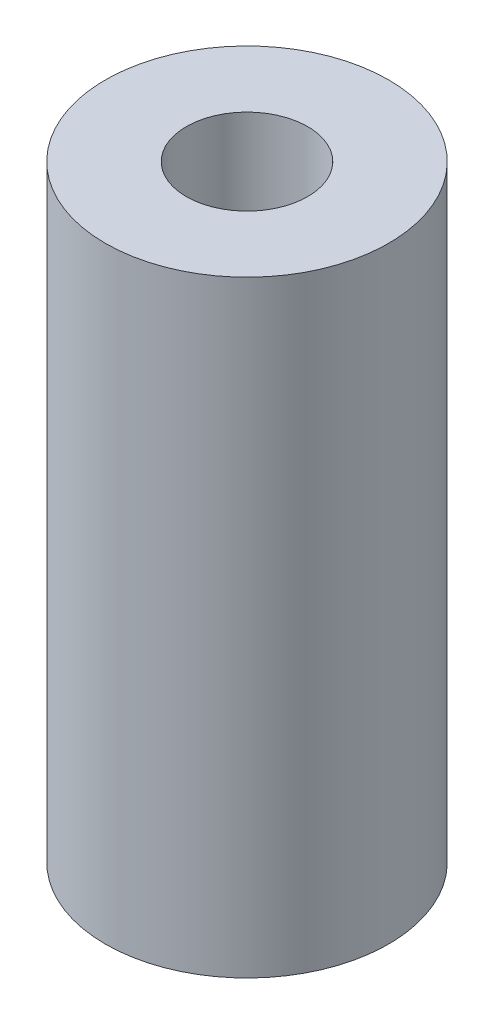
ISO-10303-21;
HEADER;
FILE_DESCRIPTION(('STEP AP214'),'2;1');
FILE_NAME('part.step','',(''),(''),'','','');
FILE_SCHEMA(('AUTOMOTIVE_DESIGN { 1 0 10303 214 1 1 1 1 }'));
ENDSEC;
DATA;
#1=APPLICATION_CONTEXT('core data for automotive mechanical design processes');
#2=APPLICATION_PROTOCOL_DEFINITION('international standard','automotive_design',2000,#1);
#3=PRODUCT_CONTEXT('',#1,'mechanical');
#4=PRODUCT('Part','Part','',(#3));
#5=PRODUCT_RELATED_PRODUCT_CATEGORY('part','',(#4));
#6=PRODUCT_DEFINITION_FORMATION('','',#4);
#7=PRODUCT_DEFINITION_CONTEXT('part definition',#1,'design');
#8=PRODUCT_DEFINITION('design','',#6,#7);
#9=PRODUCT_DEFINITION_SHAPE('','',#8);
#10=(LENGTH_UNIT() NAMED_UNIT(*) SI_UNIT(.MILLI.,.METRE.));
#11=(NAMED_UNIT(*) PLANE_ANGLE_UNIT() SI_UNIT($,.RADIAN.));
#12=(NAMED_UNIT(*) SI_UNIT($,.STERADIAN.) SOLID_ANGLE_UNIT());
#13=UNCERTAINTY_MEASURE_WITH_UNIT(LENGTH_MEASURE(1.E-05),#10,'distance_accuracy_value','');
#14=(GEOMETRIC_REPRESENTATION_CONTEXT(3) GLOBAL_UNCERTAINTY_ASSIGNED_CONTEXT((#13)) GLOBAL_UNIT_ASSIGNED_CONTEXT((#10,
#11,#12)) REPRESENTATION_CONTEXT('',''));
#15=CARTESIAN_POINT('',(0.,0.,0.));
#16=DIRECTION('',(0.,0.,1.));
#17=DIRECTION('',(1.,0.,0.));
#18=AXIS2_PLACEMENT_3D('',#15,#16,#17);
#19=CARTESIAN_POINT('',(0.,15.,0.));
#20=DIRECTION('',(0.,1.,0.));
#21=DIRECTION('',(0.,0.,1.));
#22=AXIS2_PLACEMENT_3D('',#19,#20,#21);
#23=PLANE('',#22);
#24=CARTESIAN_POINT('',(0.,15.,0.));
#25=DIRECTION('',(0.,1.,0.));
#26=DIRECTION('',(0.,0.,1.));
#27=AXIS2_PLACEMENT_3D('',#24,#25,#26);
#28=CIRCLE('',#27,3.49999999999999);
#29=CARTESIAN_POINT('',(0.,15.,3.49999999999999));
#30=VERTEX_POINT('',#29);
#31=EDGE_CURVE('E10',#30,#30,#28,.T.);
#32=ORIENTED_EDGE('',*,*,#31,.T.);
#33=EDGE_LOOP('',(#32));
#34=FACE_BOUND('',#33,.T.);
#35=CARTESIAN_POINT('',(0.,15.,0.));
#36=DIRECTION('',(0.,1.,0.));
#37=DIRECTION('',(0.,0.,1.));
#38=AXIS2_PLACEMENT_3D('',#35,#36,#37);
#39=CIRCLE('',#38,1.5);
#40=CARTESIAN_POINT('',(0.,15.,1.5));
#41=VERTEX_POINT('',#40);
#42=EDGE_CURVE('E56',#41,#41,#39,.T.);
#43=ORIENTED_EDGE('',*,*,#42,.F.);
#44=EDGE_LOOP('',(#43));
#45=FACE_BOUND('',#44,.T.);
#46=ADVANCED_FACE('F43',(#34,#45),#23,.T.);
#47=CARTESIAN_POINT('',(0.,0.,0.));
#48=DIRECTION('',(0.,1.,0.));
#49=DIRECTION('',(0.,0.,1.));
#50=AXIS2_PLACEMENT_3D('',#47,#48,#49);
#51=PLANE('',#50);
#52=CARTESIAN_POINT('',(0.,0.,0.));
#53=DIRECTION('',(0.,1.,0.));
#54=DIRECTION('',(0.,0.,1.));
#55=AXIS2_PLACEMENT_3D('',#52,#53,#54);
#56=CIRCLE('',#55,3.49999999999999);
#57=CARTESIAN_POINT('',(0.,0.,3.49999999999999));
#58=VERTEX_POINT('',#57);
#59=EDGE_CURVE('E47',#58,#58,#56,.T.);
#60=ORIENTED_EDGE('',*,*,#59,.F.);
#61=EDGE_LOOP('',(#60));
#62=FACE_BOUND('',#61,.T.);
#63=CARTESIAN_POINT('',(0.,0.,0.));
#64=DIRECTION('',(0.,1.,0.));
#65=DIRECTION('',(0.,0.,1.));
#66=AXIS2_PLACEMENT_3D('',#63,#64,#65);
#67=CIRCLE('',#66,1.5);
#68=CARTESIAN_POINT('',(0.,0.,1.5));
#69=VERTEX_POINT('',#68);
#70=EDGE_CURVE('E58',#69,#69,#67,.T.);
#71=ORIENTED_EDGE('',*,*,#70,.T.);
#72=EDGE_LOOP('',(#71));
#73=FACE_BOUND('',#72,.T.);
#74=ADVANCED_FACE('F70',(#62,#73),#51,.F.);
#75=CARTESIAN_POINT('',(0.,15.,0.));
#76=DIRECTION('',(0.,-1.,0.));
#77=DIRECTION('',(0.,0.,-1.));
#78=AXIS2_PLACEMENT_3D('',#75,#76,#77);
#79=CYLINDRICAL_SURFACE('',#78,3.49999999999999);
#80=ORIENTED_EDGE('',*,*,#31,.F.);
#81=EDGE_LOOP('',(#80));
#82=FACE_BOUND('',#81,.T.);
#83=ORIENTED_EDGE('',*,*,#59,.T.);
#84=EDGE_LOOP('',(#83));
#85=FACE_BOUND('',#84,.T.);
#86=ADVANCED_FACE('F45',(#82,#85),#79,.T.);
#87=CARTESIAN_POINT('',(0.,15.,0.));
#88=DIRECTION('',(0.,-1.,0.));
#89=DIRECTION('',(0.,0.,-1.));
#90=AXIS2_PLACEMENT_3D('',#87,#88,#89);
#91=CYLINDRICAL_SURFACE('',#90,1.5);
#92=ORIENTED_EDGE('',*,*,#42,.T.);
#93=EDGE_LOOP('',(#92));
#94=FACE_BOUND('',#93,.T.);
#95=ORIENTED_EDGE('',*,*,#70,.F.);
#96=EDGE_LOOP('',(#95));
#97=FACE_BOUND('',#96,.T.);
#98=ADVANCED_FACE('F66',(#94,#97),#91,.F.);
#99=CLOSED_SHELL('',(#46,#74,#86,#98));
#100=MANIFOLD_SOLID_BREP('B2',#99);
#101=ADVANCED_BREP_SHAPE_REPRESENTATION('',(#18,#100),#14);
#102=SHAPE_DEFINITION_REPRESENTATION(#9,#101);
ENDSEC;
END-ISO-10303-21;
